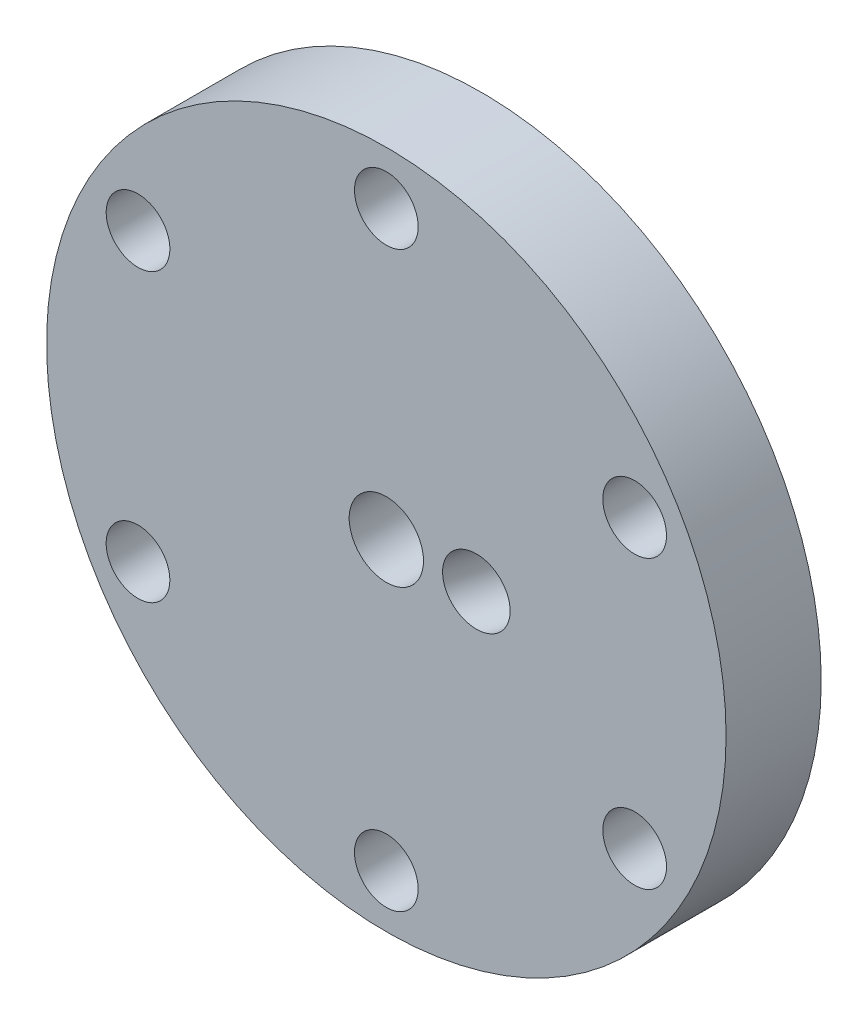
ISO-10303-21;
HEADER;
FILE_DESCRIPTION(('STEP AP214'),'2;1');
FILE_NAME('part.step','',(''),(''),'','','');
FILE_SCHEMA(('AUTOMOTIVE_DESIGN { 1 0 10303 214 1 1 1 1 }'));
ENDSEC;
DATA;
#1=APPLICATION_CONTEXT('core data for automotive mechanical design processes');
#2=APPLICATION_PROTOCOL_DEFINITION('international standard','automotive_design',2000,#1);
#3=PRODUCT_CONTEXT('',#1,'mechanical');
#4=PRODUCT('Part','Part','',(#3));
#5=PRODUCT_RELATED_PRODUCT_CATEGORY('part','',(#4));
#6=PRODUCT_DEFINITION_FORMATION('','',#4);
#7=PRODUCT_DEFINITION_CONTEXT('part definition',#1,'design');
#8=PRODUCT_DEFINITION('design','',#6,#7);
#9=PRODUCT_DEFINITION_SHAPE('','',#8);
#10=(LENGTH_UNIT() NAMED_UNIT(*) SI_UNIT(.MILLI.,.METRE.));
#11=(NAMED_UNIT(*) PLANE_ANGLE_UNIT() SI_UNIT($,.RADIAN.));
#12=(NAMED_UNIT(*) SI_UNIT($,.STERADIAN.) SOLID_ANGLE_UNIT());
#13=UNCERTAINTY_MEASURE_WITH_UNIT(LENGTH_MEASURE(1.E-05),#10,'distance_accuracy_value','');
#14=(GEOMETRIC_REPRESENTATION_CONTEXT(3) GLOBAL_UNCERTAINTY_ASSIGNED_CONTEXT((#13)) GLOBAL_UNIT_ASSIGNED_CONTEXT((#10,
#11,#12)) REPRESENTATION_CONTEXT('',''));
#15=CARTESIAN_POINT('',(0.,0.,0.));
#16=DIRECTION('',(0.,0.,1.));
#17=DIRECTION('',(1.,0.,0.));
#18=AXIS2_PLACEMENT_3D('',#15,#16,#17);
#19=CARTESIAN_POINT('',(0.,0.,7.112));
#20=DIRECTION('',(0.,0.,-1.));
#21=DIRECTION('',(-1.,0.,0.));
#22=AXIS2_PLACEMENT_3D('',#19,#20,#21);
#23=CYLINDRICAL_SURFACE('',#22,50.8);
#24=CARTESIAN_POINT('',(0.,0.,7.112));
#25=DIRECTION('',(0.,0.,1.));
#26=DIRECTION('',(1.,0.,0.));
#27=AXIS2_PLACEMENT_3D('',#24,#25,#26);
#28=CIRCLE('',#27,50.8);
#29=CARTESIAN_POINT('',(50.8,0.,7.112));
#30=VERTEX_POINT('',#29);
#31=EDGE_CURVE('E10',#30,#30,#28,.T.);
#32=ORIENTED_EDGE('',*,*,#31,.F.);
#33=EDGE_LOOP('',(#32));
#34=FACE_BOUND('',#33,.T.);
#35=CARTESIAN_POINT('',(0.,0.,-7.112));
#36=DIRECTION('',(0.,0.,1.));
#37=DIRECTION('',(1.,0.,0.));
#38=AXIS2_PLACEMENT_3D('',#35,#36,#37);
#39=CIRCLE('',#38,50.8);
#40=CARTESIAN_POINT('',(50.8,0.,-7.112));
#41=VERTEX_POINT('',#40);
#42=EDGE_CURVE('E48',#41,#41,#39,.T.);
#43=ORIENTED_EDGE('',*,*,#42,.T.);
#44=EDGE_LOOP('',(#43));
#45=FACE_BOUND('',#44,.T.);
#46=ADVANCED_FACE('F40',(#34,#45),#23,.T.);
#47=CARTESIAN_POINT('',(0.,0.,7.112));
#48=DIRECTION('',(0.,0.,1.));
#49=DIRECTION('',(1.,0.,0.));
#50=AXIS2_PLACEMENT_3D('',#47,#48,#49);
#51=PLANE('',#50);
#52=CARTESIAN_POINT('',(13.462,0.,7.112));
#53=DIRECTION('',(0.,0.,1.));
#54=DIRECTION('',(-1.,0.,0.));
#55=AXIS2_PLACEMENT_3D('',#52,#53,#54);
#56=ELLIPSE('',#55,5.04883487662389,4.8768);
#57=CARTESIAN_POINT('',(8.41316512337611,0.,7.112));
#58=VERTEX_POINT('',#57);
#59=EDGE_CURVE('E85',#58,#58,#56,.T.);
#60=ORIENTED_EDGE('',*,*,#59,.F.);
#61=EDGE_LOOP('',(#60));
#62=FACE_BOUND('',#61,.T.);
#63=CARTESIAN_POINT('',(-37.1310123923383,21.4376000000004,7.112));
#64=DIRECTION('',(0.,0.,1.));
#65=DIRECTION('',(0.50000000000001,0.866025403784433,0.));
#66=AXIS2_PLACEMENT_3D('',#63,#64,#65);
#67=CIRCLE('',#66,4.7625);
#68=CARTESIAN_POINT('',(-34.7497623923383,25.5620459855238,7.112));
#69=VERTEX_POINT('',#68);
#70=EDGE_CURVE('E80',#69,#69,#67,.T.);
#71=ORIENTED_EDGE('',*,*,#70,.F.);
#72=EDGE_LOOP('',(#71));
#73=FACE_BOUND('',#72,.T.);
#74=CARTESIAN_POINT('',(-37.1310123923388,-21.4375999999997,7.112));
#75=DIRECTION('',(0.,0.,1.));
#76=DIRECTION('',(-0.499999999999992,0.866025403784443,0.));
#77=AXIS2_PLACEMENT_3D('',#74,#75,#76);
#78=CIRCLE('',#77,4.7625);
#79=CARTESIAN_POINT('',(-39.5122623923387,-17.3131540144762,7.112));
#80=VERTEX_POINT('',#79);
#81=EDGE_CURVE('E89',#80,#80,#78,.T.);
#82=ORIENTED_EDGE('',*,*,#81,.F.);
#83=EDGE_LOOP('',(#82));
#84=FACE_BOUND('',#83,.T.);
#85=CARTESIAN_POINT('',(0.,-42.8752,7.112));
#86=DIRECTION('',(0.,0.,1.));
#87=DIRECTION('',(-1.,0.,0.));
#88=AXIS2_PLACEMENT_3D('',#85,#86,#87);
#89=CIRCLE('',#88,4.7625);
#90=CARTESIAN_POINT('',(-4.7625,-42.8752,7.112));
#91=VERTEX_POINT('',#90);
#92=EDGE_CURVE('E97',#91,#91,#89,.T.);
#93=ORIENTED_EDGE('',*,*,#92,.F.);
#94=EDGE_LOOP('',(#93));
#95=FACE_BOUND('',#94,.T.);
#96=CARTESIAN_POINT('',(37.1310123923385,-21.4376000000002,7.112));
#97=DIRECTION('',(0.,0.,1.));
#98=DIRECTION('',(-0.500000000000004,-0.866025403784436,0.));
#99=AXIS2_PLACEMENT_3D('',#96,#97,#98);
#100=CIRCLE('',#99,4.7625);
#101=CARTESIAN_POINT('',(34.7497623923384,-25.5620459855236,7.112));
#102=VERTEX_POINT('',#101);
#103=EDGE_CURVE('E105',#102,#102,#100,.T.);
#104=ORIENTED_EDGE('',*,*,#103,.F.);
#105=EDGE_LOOP('',(#104));
#106=FACE_BOUND('',#105,.T.);
#107=CARTESIAN_POINT('',(37.1310123923386,21.4375999999999,7.112));
#108=DIRECTION('',(0.,0.,1.));
#109=DIRECTION('',(0.499999999999998,-0.86602540378444,0.));
#110=AXIS2_PLACEMENT_3D('',#107,#108,#109);
#111=CIRCLE('',#110,4.7625);
#112=CARTESIAN_POINT('',(39.5122623923386,17.3131540144765,7.112));
#113=VERTEX_POINT('',#112);
#114=EDGE_CURVE('E72',#113,#113,#111,.T.);
#115=ORIENTED_EDGE('',*,*,#114,.F.);
#116=EDGE_LOOP('',(#115));
#117=FACE_BOUND('',#116,.T.);
#118=CARTESIAN_POINT('',(0.,42.8752,7.112));
#119=DIRECTION('',(0.,0.,1.));
#120=DIRECTION('',(1.,0.,0.));
#121=AXIS2_PLACEMENT_3D('',#118,#119,#120);
#122=CIRCLE('',#121,4.7625);
#123=CARTESIAN_POINT('',(4.7625,42.8752,7.112));
#124=VERTEX_POINT('',#123);
#125=EDGE_CURVE('E64',#124,#124,#122,.T.);
#126=ORIENTED_EDGE('',*,*,#125,.F.);
#127=EDGE_LOOP('',(#126));
#128=FACE_BOUND('',#127,.T.);
#129=CARTESIAN_POINT('',(0.,0.,7.112));
#130=DIRECTION('',(0.,0.,1.));
#131=DIRECTION('',(1.,0.,0.));
#132=AXIS2_PLACEMENT_3D('',#129,#130,#131);
#133=CIRCLE('',#132,5.55625);
#134=CARTESIAN_POINT('',(5.55625,0.,7.112));
#135=VERTEX_POINT('',#134);
#136=EDGE_CURVE('E56',#135,#135,#133,.T.);
#137=ORIENTED_EDGE('',*,*,#136,.F.);
#138=EDGE_LOOP('',(#137));
#139=FACE_BOUND('',#138,.T.);
#140=ORIENTED_EDGE('',*,*,#31,.T.);
#141=EDGE_LOOP('',(#140));
#142=FACE_BOUND('',#141,.T.);
#143=ADVANCED_FACE('F135',(#62,#73,#84,#95,#106,#117,#128,#139,#142),#51,.T.);
#144=CARTESIAN_POINT('',(0.,0.,-7.112));
#145=DIRECTION('',(0.,0.,1.));
#146=DIRECTION('',(1.,0.,0.));
#147=AXIS2_PLACEMENT_3D('',#144,#145,#146);
#148=PLANE('',#147);
#149=CARTESIAN_POINT('',(17.2733093131403,0.,-7.112));
#150=DIRECTION('',(0.,0.,1.));
#151=DIRECTION('',(-1.,0.,0.));
#152=AXIS2_PLACEMENT_3D('',#149,#150,#151);
#153=ELLIPSE('',#152,5.04883487662389,4.8768);
#154=CARTESIAN_POINT('',(12.2244744365164,0.,-7.112));
#155=VERTEX_POINT('',#154);
#156=EDGE_CURVE('E43',#155,#155,#153,.T.);
#157=ORIENTED_EDGE('',*,*,#156,.T.);
#158=EDGE_LOOP('',(#157));
#159=FACE_BOUND('',#158,.T.);
#160=CARTESIAN_POINT('',(-37.1310123923383,21.4376000000004,-7.112));
#161=DIRECTION('',(0.,0.,1.));
#162=DIRECTION('',(0.50000000000001,0.866025403784433,0.));
#163=AXIS2_PLACEMENT_3D('',#160,#161,#162);
#164=CIRCLE('',#163,4.7625);
#165=CARTESIAN_POINT('',(-34.7497623923383,25.5620459855238,-7.112));
#166=VERTEX_POINT('',#165);
#167=EDGE_CURVE('E84',#166,#166,#164,.T.);
#168=ORIENTED_EDGE('',*,*,#167,.T.);
#169=EDGE_LOOP('',(#168));
#170=FACE_BOUND('',#169,.T.);
#171=CARTESIAN_POINT('',(-37.1310123923388,-21.4375999999997,-7.112));
#172=DIRECTION('',(0.,0.,1.));
#173=DIRECTION('',(-0.499999999999992,0.866025403784443,0.));
#174=AXIS2_PLACEMENT_3D('',#171,#172,#173);
#175=CIRCLE('',#174,4.7625);
#176=CARTESIAN_POINT('',(-39.5122623923387,-17.3131540144762,-7.112));
#177=VERTEX_POINT('',#176);
#178=EDGE_CURVE('E93',#177,#177,#175,.T.);
#179=ORIENTED_EDGE('',*,*,#178,.T.);
#180=EDGE_LOOP('',(#179));
#181=FACE_BOUND('',#180,.T.);
#182=CARTESIAN_POINT('',(0.,-42.8752,-7.112));
#183=DIRECTION('',(0.,0.,1.));
#184=DIRECTION('',(-1.,0.,0.));
#185=AXIS2_PLACEMENT_3D('',#182,#183,#184);
#186=CIRCLE('',#185,4.7625);
#187=CARTESIAN_POINT('',(-4.7625,-42.8752,-7.112));
#188=VERTEX_POINT('',#187);
#189=EDGE_CURVE('E101',#188,#188,#186,.T.);
#190=ORIENTED_EDGE('',*,*,#189,.T.);
#191=EDGE_LOOP('',(#190));
#192=FACE_BOUND('',#191,.T.);
#193=CARTESIAN_POINT('',(37.1310123923385,-21.4376000000002,-7.112));
#194=DIRECTION('',(0.,0.,1.));
#195=DIRECTION('',(-0.500000000000004,-0.866025403784436,0.));
#196=AXIS2_PLACEMENT_3D('',#193,#194,#195);
#197=CIRCLE('',#196,4.7625);
#198=CARTESIAN_POINT('',(34.7497623923384,-25.5620459855236,-7.112));
#199=VERTEX_POINT('',#198);
#200=EDGE_CURVE('E76',#199,#199,#197,.T.);
#201=ORIENTED_EDGE('',*,*,#200,.T.);
#202=EDGE_LOOP('',(#201));
#203=FACE_BOUND('',#202,.T.);
#204=CARTESIAN_POINT('',(37.1310123923386,21.4375999999999,-7.112));
#205=DIRECTION('',(0.,0.,1.));
#206=DIRECTION('',(0.499999999999998,-0.86602540378444,0.));
#207=AXIS2_PLACEMENT_3D('',#204,#205,#206);
#208=CIRCLE('',#207,4.7625);
#209=CARTESIAN_POINT('',(39.5122623923386,17.3131540144765,-7.112));
#210=VERTEX_POINT('',#209);
#211=EDGE_CURVE('E68',#210,#210,#208,.T.);
#212=ORIENTED_EDGE('',*,*,#211,.T.);
#213=EDGE_LOOP('',(#212));
#214=FACE_BOUND('',#213,.T.);
#215=CARTESIAN_POINT('',(0.,42.8752,-7.112));
#216=DIRECTION('',(0.,0.,1.));
#217=DIRECTION('',(1.,0.,0.));
#218=AXIS2_PLACEMENT_3D('',#215,#216,#217);
#219=CIRCLE('',#218,4.7625);
#220=CARTESIAN_POINT('',(4.7625,42.8752,-7.112));
#221=VERTEX_POINT('',#220);
#222=EDGE_CURVE('E60',#221,#221,#219,.T.);
#223=ORIENTED_EDGE('',*,*,#222,.T.);
#224=EDGE_LOOP('',(#223));
#225=FACE_BOUND('',#224,.T.);
#226=CARTESIAN_POINT('',(0.,0.,-7.112));
#227=DIRECTION('',(0.,0.,1.));
#228=DIRECTION('',(1.,0.,0.));
#229=AXIS2_PLACEMENT_3D('',#226,#227,#228);
#230=CIRCLE('',#229,5.55625);
#231=CARTESIAN_POINT('',(5.55625,0.,-7.112));
#232=VERTEX_POINT('',#231);
#233=EDGE_CURVE('E54',#232,#232,#230,.T.);
#234=ORIENTED_EDGE('',*,*,#233,.T.);
#235=EDGE_LOOP('',(#234));
#236=FACE_BOUND('',#235,.T.);
#237=ORIENTED_EDGE('',*,*,#42,.F.);
#238=EDGE_LOOP('',(#237));
#239=FACE_BOUND('',#238,.T.);
#240=ADVANCED_FACE('F120',(#159,#170,#181,#192,#203,#214,#225,#236,#239),#148,.F.);
#241=CARTESIAN_POINT('',(0.,0.,-7.112));
#242=DIRECTION('',(0.,0.,1.));
#243=DIRECTION('',(1.,0.,0.));
#244=AXIS2_PLACEMENT_3D('',#241,#242,#243);
#245=CYLINDRICAL_SURFACE('',#244,5.55625);
#246=ORIENTED_EDGE('',*,*,#233,.F.);
#247=EDGE_LOOP('',(#246));
#248=FACE_BOUND('',#247,.T.);
#249=ORIENTED_EDGE('',*,*,#136,.T.);
#250=EDGE_LOOP('',(#249));
#251=FACE_BOUND('',#250,.T.);
#252=ADVANCED_FACE('F146',(#248,#251),#245,.F.);
#253=CARTESIAN_POINT('',(0.,42.8752,-7.112));
#254=DIRECTION('',(0.,0.,1.));
#255=DIRECTION('',(1.,0.,0.));
#256=AXIS2_PLACEMENT_3D('',#253,#254,#255);
#257=CYLINDRICAL_SURFACE('',#256,4.7625);
#258=ORIENTED_EDGE('',*,*,#222,.F.);
#259=EDGE_LOOP('',(#258));
#260=FACE_BOUND('',#259,.T.);
#261=ORIENTED_EDGE('',*,*,#125,.T.);
#262=EDGE_LOOP('',(#261));
#263=FACE_BOUND('',#262,.T.);
#264=ADVANCED_FACE('F150',(#260,#263),#257,.F.);
#265=CARTESIAN_POINT('',(37.1310123923386,21.4375999999999,-7.112));
#266=DIRECTION('',(0.,0.,1.));
#267=DIRECTION('',(1.,0.,0.));
#268=AXIS2_PLACEMENT_3D('',#265,#266,#267);
#269=CYLINDRICAL_SURFACE('',#268,4.7625);
#270=ORIENTED_EDGE('',*,*,#211,.F.);
#271=EDGE_LOOP('',(#270));
#272=FACE_BOUND('',#271,.T.);
#273=ORIENTED_EDGE('',*,*,#114,.T.);
#274=EDGE_LOOP('',(#273));
#275=FACE_BOUND('',#274,.T.);
#276=ADVANCED_FACE('F156',(#272,#275),#269,.F.);
#277=CARTESIAN_POINT('',(37.1310123923385,-21.4376000000002,-7.112));
#278=DIRECTION('',(0.,0.,1.));
#279=DIRECTION('',(1.,0.,0.));
#280=AXIS2_PLACEMENT_3D('',#277,#278,#279);
#281=CYLINDRICAL_SURFACE('',#280,4.7625);
#282=ORIENTED_EDGE('',*,*,#200,.F.);
#283=EDGE_LOOP('',(#282));
#284=FACE_BOUND('',#283,.T.);
#285=ORIENTED_EDGE('',*,*,#103,.T.);
#286=EDGE_LOOP('',(#285));
#287=FACE_BOUND('',#286,.T.);
#288=ADVANCED_FACE('F159',(#284,#287),#281,.F.);
#289=CARTESIAN_POINT('',(0.,-42.8752,-7.112));
#290=DIRECTION('',(0.,0.,1.));
#291=DIRECTION('',(1.,0.,0.));
#292=AXIS2_PLACEMENT_3D('',#289,#290,#291);
#293=CYLINDRICAL_SURFACE('',#292,4.7625);
#294=ORIENTED_EDGE('',*,*,#189,.F.);
#295=EDGE_LOOP('',(#294));
#296=FACE_BOUND('',#295,.T.);
#297=ORIENTED_EDGE('',*,*,#92,.T.);
#298=EDGE_LOOP('',(#297));
#299=FACE_BOUND('',#298,.T.);
#300=ADVANCED_FACE('F164',(#296,#299),#293,.F.);
#301=CARTESIAN_POINT('',(-37.1310123923388,-21.4375999999997,-7.112));
#302=DIRECTION('',(0.,0.,1.));
#303=DIRECTION('',(1.,0.,0.));
#304=AXIS2_PLACEMENT_3D('',#301,#302,#303);
#305=CYLINDRICAL_SURFACE('',#304,4.7625);
#306=ORIENTED_EDGE('',*,*,#178,.F.);
#307=EDGE_LOOP('',(#306));
#308=FACE_BOUND('',#307,.T.);
#309=ORIENTED_EDGE('',*,*,#81,.T.);
#310=EDGE_LOOP('',(#309));
#311=FACE_BOUND('',#310,.T.);
#312=ADVANCED_FACE('F130',(#308,#311),#305,.F.);
#313=CARTESIAN_POINT('',(-37.1310123923383,21.4376000000004,-7.112));
#314=DIRECTION('',(0.,0.,1.));
#315=DIRECTION('',(1.,0.,0.));
#316=AXIS2_PLACEMENT_3D('',#313,#314,#315);
#317=CYLINDRICAL_SURFACE('',#316,4.7625);
#318=ORIENTED_EDGE('',*,*,#167,.F.);
#319=EDGE_LOOP('',(#318));
#320=FACE_BOUND('',#319,.T.);
#321=ORIENTED_EDGE('',*,*,#70,.T.);
#322=EDGE_LOOP('',(#321));
#323=FACE_BOUND('',#322,.T.);
#324=ADVANCED_FACE('F125',(#320,#323),#317,.F.);
#325=CARTESIAN_POINT('',(20.036003745604,0.,-17.4225159877423));
#326=DIRECTION('',(-0.258819045102521,0.,0.965925826289068));
#327=DIRECTION('',(0.965925826289068,0.,0.258819045102521));
#328=AXIS2_PLACEMENT_3D('',#325,#326,#327);
#329=CYLINDRICAL_SURFACE('',#328,4.8768);
#330=ORIENTED_EDGE('',*,*,#59,.T.);
#331=EDGE_LOOP('',(#330));
#332=FACE_BOUND('',#331,.T.);
#333=ORIENTED_EDGE('',*,*,#156,.F.);
#334=EDGE_LOOP('',(#333));
#335=FACE_BOUND('',#334,.T.);
#336=ADVANCED_FACE('F123',(#332,#335),#329,.F.);
#337=CLOSED_SHELL('',(#46,#143,#240,#252,#264,#276,#288,#300,#312,#324,#336));
#338=MANIFOLD_SOLID_BREP('B2',#337);
#339=ADVANCED_BREP_SHAPE_REPRESENTATION('',(#18,#338),#14);
#340=SHAPE_DEFINITION_REPRESENTATION(#9,#339);
ENDSEC;
END-ISO-10303-21;
